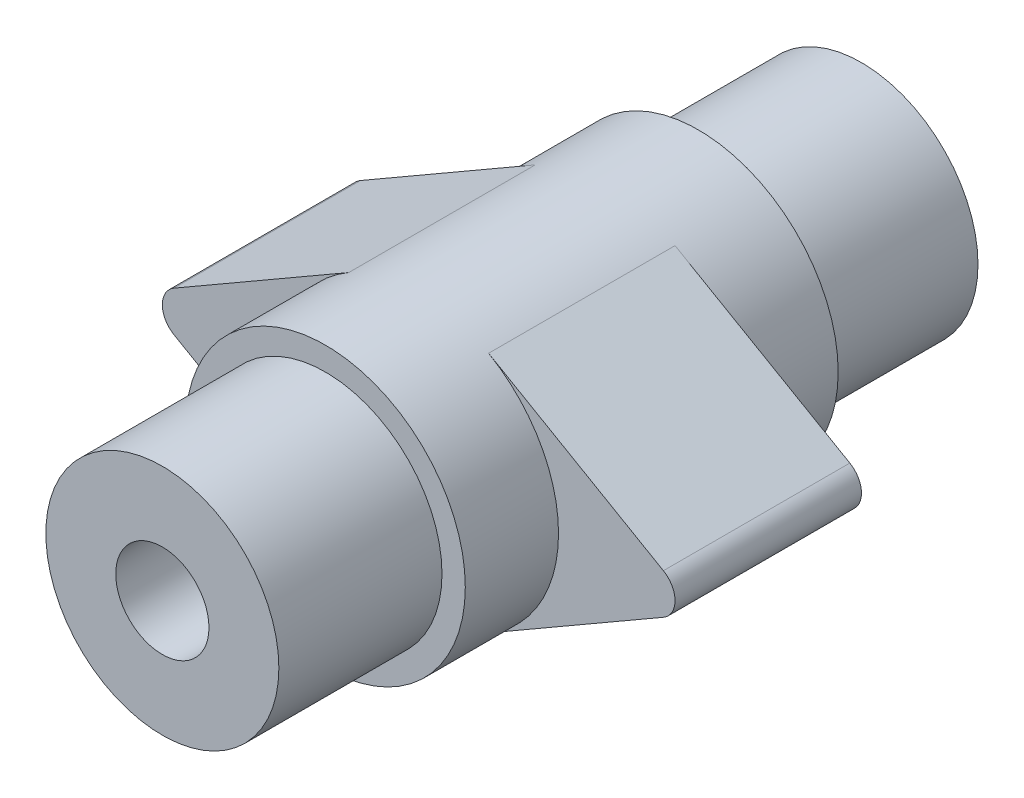
ISO-10303-21;
HEADER;
FILE_DESCRIPTION(('STEP AP214'),'2;1');
FILE_NAME('part.step','',(''),(''),'','','');
FILE_SCHEMA(('AUTOMOTIVE_DESIGN { 1 0 10303 214 1 1 1 1 }'));
ENDSEC;
DATA;
#1=APPLICATION_CONTEXT('core data for automotive mechanical design processes');
#2=APPLICATION_PROTOCOL_DEFINITION('international standard','automotive_design',2000,#1);
#3=PRODUCT_CONTEXT('',#1,'mechanical');
#4=PRODUCT('Part','Part','',(#3));
#5=PRODUCT_RELATED_PRODUCT_CATEGORY('part','',(#4));
#6=PRODUCT_DEFINITION_FORMATION('','',#4);
#7=PRODUCT_DEFINITION_CONTEXT('part definition',#1,'design');
#8=PRODUCT_DEFINITION('design','',#6,#7);
#9=PRODUCT_DEFINITION_SHAPE('','',#8);
#10=(LENGTH_UNIT() NAMED_UNIT(*) SI_UNIT(.MILLI.,.METRE.));
#11=(NAMED_UNIT(*) PLANE_ANGLE_UNIT() SI_UNIT($,.RADIAN.));
#12=(NAMED_UNIT(*) SI_UNIT($,.STERADIAN.) SOLID_ANGLE_UNIT());
#13=UNCERTAINTY_MEASURE_WITH_UNIT(LENGTH_MEASURE(1.E-05),#10,'distance_accuracy_value','');
#14=(GEOMETRIC_REPRESENTATION_CONTEXT(3) GLOBAL_UNCERTAINTY_ASSIGNED_CONTEXT((#13)) GLOBAL_UNIT_ASSIGNED_CONTEXT((#10,
#11,#12)) REPRESENTATION_CONTEXT('',''));
#15=CARTESIAN_POINT('',(0.,0.,0.));
#16=DIRECTION('',(0.,0.,1.));
#17=DIRECTION('',(1.,0.,0.));
#18=AXIS2_PLACEMENT_3D('',#15,#16,#17);
#19=CARTESIAN_POINT('',(0.,0.,16.));
#20=DIRECTION('',(0.,0.,-1.));
#21=DIRECTION('',(-1.,0.,0.));
#22=AXIS2_PLACEMENT_3D('',#19,#20,#21);
#23=CYLINDRICAL_SURFACE('',#22,6.);
#24=DIRECTION('',(0.,0.,-1.));
#25=VECTOR('',#24,1.);
#26=CARTESIAN_POINT('',(-3.,5.19615242270663,12.));
#27=LINE('',#26,#25);
#28=CARTESIAN_POINT('',(-3.,5.19615242270663,12.));
#29=VERTEX_POINT('',#28);
#30=CARTESIAN_POINT('',(-3.,5.19615242270663,4.));
#31=VERTEX_POINT('',#30);
#32=EDGE_CURVE('E61',#29,#31,#27,.T.);
#33=ORIENTED_EDGE('',*,*,#32,.F.);
#34=CARTESIAN_POINT('',(0.,0.,12.));
#35=DIRECTION('',(0.,0.,1.));
#36=DIRECTION('',(1.,0.,0.));
#37=AXIS2_PLACEMENT_3D('',#34,#35,#36);
#38=CIRCLE('',#37,6.);
#39=CARTESIAN_POINT('',(-3.,-5.19615242270663,12.));
#40=VERTEX_POINT('',#39);
#41=EDGE_CURVE('E66',#29,#40,#38,.T.);
#42=ORIENTED_EDGE('',*,*,#41,.T.);
#43=DIRECTION('',(0.,0.,-1.));
#44=VECTOR('',#43,1.);
#45=CARTESIAN_POINT('',(-3.,-5.19615242270663,12.));
#46=LINE('',#45,#44);
#47=CARTESIAN_POINT('',(-3.,-5.19615242270663,4.));
#48=VERTEX_POINT('',#47);
#49=EDGE_CURVE('E107',#40,#48,#46,.T.);
#50=ORIENTED_EDGE('',*,*,#49,.T.);
#51=CARTESIAN_POINT('',(0.,0.,4.));
#52=DIRECTION('',(0.,0.,1.));
#53=DIRECTION('',(1.,0.,0.));
#54=AXIS2_PLACEMENT_3D('',#51,#52,#53);
#55=CIRCLE('',#54,6.);
#56=EDGE_CURVE('E111',#31,#48,#55,.T.);
#57=ORIENTED_EDGE('',*,*,#56,.F.);
#58=EDGE_LOOP('',(#33,#42,#50,#57));
#59=FACE_BOUND('',#58,.T.);
#60=DIRECTION('',(0.,0.,-1.));
#61=VECTOR('',#60,1.);
#62=CARTESIAN_POINT('',(3.,-5.19615242270663,12.));
#63=LINE('',#62,#61);
#64=CARTESIAN_POINT('',(3.,-5.19615242270663,12.));
#65=VERTEX_POINT('',#64);
#66=CARTESIAN_POINT('',(3.,-5.19615242270663,4.));
#67=VERTEX_POINT('',#66);
#68=EDGE_CURVE('E166',#65,#67,#63,.T.);
#69=ORIENTED_EDGE('',*,*,#68,.F.);
#70=CARTESIAN_POINT('',(0.,0.,12.));
#71=DIRECTION('',(0.,0.,1.));
#72=DIRECTION('',(1.,0.,0.));
#73=AXIS2_PLACEMENT_3D('',#70,#71,#72);
#74=CIRCLE('',#73,6.);
#75=CARTESIAN_POINT('',(3.,5.19615242270663,12.));
#76=VERTEX_POINT('',#75);
#77=EDGE_CURVE('E150',#76,#65,#74,.F.);
#78=ORIENTED_EDGE('',*,*,#77,.F.);
#79=DIRECTION('',(0.,0.,-1.));
#80=VECTOR('',#79,1.);
#81=CARTESIAN_POINT('',(3.,5.19615242270663,12.));
#82=LINE('',#81,#80);
#83=CARTESIAN_POINT('',(3.,5.19615242270663,4.));
#84=VERTEX_POINT('',#83);
#85=EDGE_CURVE('E169',#76,#84,#82,.T.);
#86=ORIENTED_EDGE('',*,*,#85,.T.);
#87=CARTESIAN_POINT('',(0.,0.,4.));
#88=DIRECTION('',(0.,0.,1.));
#89=DIRECTION('',(1.,0.,0.));
#90=AXIS2_PLACEMENT_3D('',#87,#88,#89);
#91=CIRCLE('',#90,6.);
#92=EDGE_CURVE('E161',#84,#67,#91,.F.);
#93=ORIENTED_EDGE('',*,*,#92,.T.);
#94=EDGE_LOOP('',(#69,#78,#86,#93));
#95=FACE_BOUND('',#94,.T.);
#96=CARTESIAN_POINT('',(0.,0.,16.));
#97=DIRECTION('',(0.,0.,1.));
#98=DIRECTION('',(1.,0.,0.));
#99=AXIS2_PLACEMENT_3D('',#96,#97,#98);
#100=CIRCLE('',#99,6.);
#101=CARTESIAN_POINT('',(6.,0.,16.));
#102=VERTEX_POINT('',#101);
#103=EDGE_CURVE('E53',#102,#102,#100,.T.);
#104=ORIENTED_EDGE('',*,*,#103,.F.);
#105=EDGE_LOOP('',(#104));
#106=FACE_BOUND('',#105,.T.);
#107=CARTESIAN_POINT('',(0.,0.,0.));
#108=DIRECTION('',(0.,0.,1.));
#109=DIRECTION('',(1.,0.,0.));
#110=AXIS2_PLACEMENT_3D('',#107,#108,#109);
#111=CIRCLE('',#110,6.);
#112=CARTESIAN_POINT('',(6.,0.,0.));
#113=VERTEX_POINT('',#112);
#114=EDGE_CURVE('E48',#113,#113,#111,.T.);
#115=ORIENTED_EDGE('',*,*,#114,.T.);
#116=EDGE_LOOP('',(#115));
#117=FACE_BOUND('',#116,.T.);
#118=ADVANCED_FACE('F45',(#59,#95,#106,#117),#23,.T.);
#119=CARTESIAN_POINT('',(0.,0.,16.));
#120=DIRECTION('',(0.,0.,1.));
#121=DIRECTION('',(1.,0.,0.));
#122=AXIS2_PLACEMENT_3D('',#119,#120,#121);
#123=PLANE('',#122);
#124=CARTESIAN_POINT('',(0.,0.,16.));
#125=DIRECTION('',(0.,0.,1.));
#126=DIRECTION('',(1.,0.,0.));
#127=AXIS2_PLACEMENT_3D('',#124,#125,#126);
#128=CIRCLE('',#127,5.);
#129=CARTESIAN_POINT('',(5.,0.,16.));
#130=VERTEX_POINT('',#129);
#131=EDGE_CURVE('E11',#130,#130,#128,.T.);
#132=ORIENTED_EDGE('',*,*,#131,.F.);
#133=EDGE_LOOP('',(#132));
#134=FACE_BOUND('',#133,.T.);
#135=ORIENTED_EDGE('',*,*,#103,.T.);
#136=EDGE_LOOP('',(#135));
#137=FACE_BOUND('',#136,.T.);
#138=ADVANCED_FACE('F182',(#134,#137),#123,.T.);
#139=CARTESIAN_POINT('',(0.,0.,0.));
#140=DIRECTION('',(0.,0.,1.));
#141=DIRECTION('',(1.,0.,0.));
#142=AXIS2_PLACEMENT_3D('',#139,#140,#141);
#143=PLANE('',#142);
#144=CARTESIAN_POINT('',(0.,0.,0.));
#145=DIRECTION('',(0.,0.,1.));
#146=DIRECTION('',(1.,0.,0.));
#147=AXIS2_PLACEMENT_3D('',#144,#145,#146);
#148=CIRCLE('',#147,5.);
#149=CARTESIAN_POINT('',(5.,0.,0.));
#150=VERTEX_POINT('',#149);
#151=EDGE_CURVE('E344',#150,#150,#148,.T.);
#152=ORIENTED_EDGE('',*,*,#151,.T.);
#153=EDGE_LOOP('',(#152));
#154=FACE_BOUND('',#153,.T.);
#155=ORIENTED_EDGE('',*,*,#114,.F.);
#156=EDGE_LOOP('',(#155));
#157=FACE_BOUND('',#156,.T.);
#158=ADVANCED_FACE('F179',(#154,#157),#143,.F.);
#159=CARTESIAN_POINT('',(10.,0.,12.));
#160=DIRECTION('',(0.,0.,-1.));
#161=DIRECTION('',(-1.,0.,0.));
#162=AXIS2_PLACEMENT_3D('',#159,#160,#161);
#163=CYLINDRICAL_SURFACE('',#162,1.);
#164=CARTESIAN_POINT('',(10.,0.,4.));
#165=DIRECTION('',(0.,0.,1.));
#166=DIRECTION('',(1.,0.,0.));
#167=AXIS2_PLACEMENT_3D('',#164,#165,#166);
#168=CIRCLE('',#167,1.);
#169=CARTESIAN_POINT('',(10.5,0.866025403784439,4.));
#170=VERTEX_POINT('',#169);
#171=CARTESIAN_POINT('',(10.5,-0.866025403784441,4.));
#172=VERTEX_POINT('',#171);
#173=EDGE_CURVE('E138',#170,#172,#168,.F.);
#174=ORIENTED_EDGE('',*,*,#173,.F.);
#175=DIRECTION('',(0.,0.,-1.));
#176=VECTOR('',#175,1.);
#177=CARTESIAN_POINT('',(10.5,0.866025403784439,12.));
#178=LINE('',#177,#176);
#179=CARTESIAN_POINT('',(10.5,0.866025403784439,12.));
#180=VERTEX_POINT('',#179);
#181=EDGE_CURVE('E171',#180,#170,#178,.T.);
#182=ORIENTED_EDGE('',*,*,#181,.F.);
#183=CARTESIAN_POINT('',(10.,0.,12.));
#184=DIRECTION('',(0.,0.,1.));
#185=DIRECTION('',(1.,0.,0.));
#186=AXIS2_PLACEMENT_3D('',#183,#184,#185);
#187=CIRCLE('',#186,1.);
#188=CARTESIAN_POINT('',(10.5,-0.866025403784441,12.));
#189=VERTEX_POINT('',#188);
#190=EDGE_CURVE('E143',#180,#189,#187,.F.);
#191=ORIENTED_EDGE('',*,*,#190,.T.);
#192=DIRECTION('',(0.,0.,-1.));
#193=VECTOR('',#192,1.);
#194=CARTESIAN_POINT('',(10.5,-0.866025403784441,12.));
#195=LINE('',#194,#193);
#196=EDGE_CURVE('E155',#189,#172,#195,.T.);
#197=ORIENTED_EDGE('',*,*,#196,.T.);
#198=EDGE_LOOP('',(#174,#182,#191,#197));
#199=FACE_BOUND('',#198,.T.);
#200=ADVANCED_FACE('F181',(#199),#163,.T.);
#201=CARTESIAN_POINT('',(3.,5.19615242270663,12.));
#202=DIRECTION('',(0.5,0.866025403784439,0.));
#203=DIRECTION('',(-0.866025403784439,0.5,0.));
#204=AXIS2_PLACEMENT_3D('',#201,#202,#203);
#205=PLANE('',#204);
#206=DIRECTION('',(0.866025403784439,-0.5,0.));
#207=VECTOR('',#206,1.);
#208=CARTESIAN_POINT('',(3.,5.19615242270663,4.));
#209=LINE('',#208,#207);
#210=EDGE_CURVE('E158',#84,#170,#209,.T.);
#211=ORIENTED_EDGE('',*,*,#210,.F.);
#212=ORIENTED_EDGE('',*,*,#85,.F.);
#213=DIRECTION('',(0.866025403784439,-0.5,0.));
#214=VECTOR('',#213,1.);
#215=CARTESIAN_POINT('',(3.,5.19615242270663,12.));
#216=LINE('',#215,#214);
#217=EDGE_CURVE('E146',#76,#180,#216,.T.);
#218=ORIENTED_EDGE('',*,*,#217,.T.);
#219=ORIENTED_EDGE('',*,*,#181,.T.);
#220=EDGE_LOOP('',(#211,#212,#218,#219));
#221=FACE_BOUND('',#220,.T.);
#222=ADVANCED_FACE('F189',(#221),#205,.T.);
#223=CARTESIAN_POINT('',(3.,-5.19615242270663,12.));
#224=DIRECTION('',(-0.5,0.866025403784439,0.));
#225=DIRECTION('',(-0.866025403784439,-0.5,0.));
#226=AXIS2_PLACEMENT_3D('',#223,#224,#225);
#227=PLANE('',#226);
#228=DIRECTION('',(0.866025403784439,0.5,0.));
#229=VECTOR('',#228,1.);
#230=CARTESIAN_POINT('',(3.,-5.19615242270663,4.));
#231=LINE('',#230,#229);
#232=EDGE_CURVE('E147',#67,#172,#231,.T.);
#233=ORIENTED_EDGE('',*,*,#232,.T.);
#234=ORIENTED_EDGE('',*,*,#196,.F.);
#235=DIRECTION('',(0.866025403784439,0.5,0.));
#236=VECTOR('',#235,1.);
#237=CARTESIAN_POINT('',(3.,-5.19615242270663,12.));
#238=LINE('',#237,#236);
#239=EDGE_CURVE('E153',#65,#189,#238,.T.);
#240=ORIENTED_EDGE('',*,*,#239,.F.);
#241=ORIENTED_EDGE('',*,*,#68,.T.);
#242=EDGE_LOOP('',(#233,#234,#240,#241));
#243=FACE_BOUND('',#242,.T.);
#244=ADVANCED_FACE('F212',(#243),#227,.F.);
#245=CARTESIAN_POINT('',(0.,0.,12.));
#246=DIRECTION('',(0.,0.,1.));
#247=DIRECTION('',(1.,0.,0.));
#248=AXIS2_PLACEMENT_3D('',#245,#246,#247);
#249=PLANE('',#248);
#250=ORIENTED_EDGE('',*,*,#190,.F.);
#251=ORIENTED_EDGE('',*,*,#217,.F.);
#252=ORIENTED_EDGE('',*,*,#77,.T.);
#253=ORIENTED_EDGE('',*,*,#239,.T.);
#254=EDGE_LOOP('',(#250,#251,#252,#253));
#255=FACE_BOUND('',#254,.T.);
#256=ADVANCED_FACE('F221',(#255),#249,.T.);
#257=CARTESIAN_POINT('',(0.,0.,4.));
#258=DIRECTION('',(0.,0.,1.));
#259=DIRECTION('',(1.,0.,0.));
#260=AXIS2_PLACEMENT_3D('',#257,#258,#259);
#261=PLANE('',#260);
#262=ORIENTED_EDGE('',*,*,#173,.T.);
#263=ORIENTED_EDGE('',*,*,#232,.F.);
#264=ORIENTED_EDGE('',*,*,#92,.F.);
#265=ORIENTED_EDGE('',*,*,#210,.T.);
#266=EDGE_LOOP('',(#262,#263,#264,#265));
#267=FACE_BOUND('',#266,.T.);
#268=ADVANCED_FACE('F230',(#267),#261,.F.);
#269=CARTESIAN_POINT('',(-3.,5.19615242270663,12.));
#270=DIRECTION('',(0.5,-0.866025403784439,0.));
#271=DIRECTION('',(0.866025403784439,0.5,0.));
#272=AXIS2_PLACEMENT_3D('',#269,#270,#271);
#273=PLANE('',#272);
#274=DIRECTION('',(-0.866025403784439,-0.5,0.));
#275=VECTOR('',#274,1.);
#276=CARTESIAN_POINT('',(-3.,5.19615242270663,4.));
#277=LINE('',#276,#275);
#278=CARTESIAN_POINT('',(-10.5,0.866025403784439,4.));
#279=VERTEX_POINT('',#278);
#280=EDGE_CURVE('E128',#31,#279,#277,.T.);
#281=ORIENTED_EDGE('',*,*,#280,.T.);
#282=DIRECTION('',(0.,0.,-1.));
#283=VECTOR('',#282,1.);
#284=CARTESIAN_POINT('',(-10.5,0.866025403784439,12.));
#285=LINE('',#284,#283);
#286=CARTESIAN_POINT('',(-10.5,0.866025403784439,12.));
#287=VERTEX_POINT('',#286);
#288=EDGE_CURVE('E353',#287,#279,#285,.T.);
#289=ORIENTED_EDGE('',*,*,#288,.F.);
#290=DIRECTION('',(-0.866025403784439,-0.5,0.));
#291=VECTOR('',#290,1.);
#292=CARTESIAN_POINT('',(-3.,5.19615242270663,12.));
#293=LINE('',#292,#291);
#294=EDGE_CURVE('E129',#29,#287,#293,.T.);
#295=ORIENTED_EDGE('',*,*,#294,.F.);
#296=ORIENTED_EDGE('',*,*,#32,.T.);
#297=EDGE_LOOP('',(#281,#289,#295,#296));
#298=FACE_BOUND('',#297,.T.);
#299=ADVANCED_FACE('F239',(#298),#273,.F.);
#300=CARTESIAN_POINT('',(-10.,0.,12.));
#301=DIRECTION('',(0.,0.,-1.));
#302=DIRECTION('',(-1.,0.,0.));
#303=AXIS2_PLACEMENT_3D('',#300,#301,#302);
#304=CYLINDRICAL_SURFACE('',#303,1.);
#305=CARTESIAN_POINT('',(-10.,0.,4.));
#306=DIRECTION('',(0.,0.,1.));
#307=DIRECTION('',(1.,0.,0.));
#308=AXIS2_PLACEMENT_3D('',#305,#306,#307);
#309=CIRCLE('',#308,1.);
#310=CARTESIAN_POINT('',(-10.5,-0.866025403784439,4.));
#311=VERTEX_POINT('',#310);
#312=EDGE_CURVE('E123',#279,#311,#309,.T.);
#313=ORIENTED_EDGE('',*,*,#312,.T.);
#314=DIRECTION('',(0.,0.,-1.));
#315=VECTOR('',#314,1.);
#316=CARTESIAN_POINT('',(-10.5,-0.866025403784439,12.));
#317=LINE('',#316,#315);
#318=CARTESIAN_POINT('',(-10.5,-0.866025403784439,12.));
#319=VERTEX_POINT('',#318);
#320=EDGE_CURVE('E115',#319,#311,#317,.T.);
#321=ORIENTED_EDGE('',*,*,#320,.F.);
#322=CARTESIAN_POINT('',(-10.,0.,12.));
#323=DIRECTION('',(0.,0.,1.));
#324=DIRECTION('',(1.,0.,0.));
#325=AXIS2_PLACEMENT_3D('',#322,#323,#324);
#326=CIRCLE('',#325,1.);
#327=EDGE_CURVE('E132',#287,#319,#326,.T.);
#328=ORIENTED_EDGE('',*,*,#327,.F.);
#329=ORIENTED_EDGE('',*,*,#288,.T.);
#330=EDGE_LOOP('',(#313,#321,#328,#329));
#331=FACE_BOUND('',#330,.T.);
#332=ADVANCED_FACE('F248',(#331),#304,.T.);
#333=CARTESIAN_POINT('',(-3.,-5.19615242270663,12.));
#334=DIRECTION('',(-0.5,-0.866025403784439,0.));
#335=DIRECTION('',(0.866025403784438,-0.5,0.));
#336=AXIS2_PLACEMENT_3D('',#333,#334,#335);
#337=PLANE('',#336);
#338=DIRECTION('',(-0.866025403784438,0.5,0.));
#339=VECTOR('',#338,1.);
#340=CARTESIAN_POINT('',(-3.,-5.19615242270663,4.));
#341=LINE('',#340,#339);
#342=EDGE_CURVE('E118',#48,#311,#341,.T.);
#343=ORIENTED_EDGE('',*,*,#342,.F.);
#344=ORIENTED_EDGE('',*,*,#49,.F.);
#345=DIRECTION('',(-0.866025403784438,0.5,0.));
#346=VECTOR('',#345,1.);
#347=CARTESIAN_POINT('',(-3.,-5.19615242270663,12.));
#348=LINE('',#347,#346);
#349=EDGE_CURVE('E140',#40,#319,#348,.T.);
#350=ORIENTED_EDGE('',*,*,#349,.T.);
#351=ORIENTED_EDGE('',*,*,#320,.T.);
#352=EDGE_LOOP('',(#343,#344,#350,#351));
#353=FACE_BOUND('',#352,.T.);
#354=ADVANCED_FACE('F119',(#353),#337,.T.);
#355=CARTESIAN_POINT('',(-10.,0.,12.));
#356=DIRECTION('',(0.,0.,1.));
#357=DIRECTION('',(1.,0.,0.));
#358=AXIS2_PLACEMENT_3D('',#355,#356,#357);
#359=PLANE('',#358);
#360=ORIENTED_EDGE('',*,*,#294,.T.);
#361=ORIENTED_EDGE('',*,*,#327,.T.);
#362=ORIENTED_EDGE('',*,*,#349,.F.);
#363=ORIENTED_EDGE('',*,*,#41,.F.);
#364=EDGE_LOOP('',(#360,#361,#362,#363));
#365=FACE_BOUND('',#364,.T.);
#366=ADVANCED_FACE('F265',(#365),#359,.T.);
#367=CARTESIAN_POINT('',(-10.,0.,4.));
#368=DIRECTION('',(0.,0.,1.));
#369=DIRECTION('',(1.,0.,0.));
#370=AXIS2_PLACEMENT_3D('',#367,#368,#369);
#371=PLANE('',#370);
#372=ORIENTED_EDGE('',*,*,#280,.F.);
#373=ORIENTED_EDGE('',*,*,#56,.T.);
#374=ORIENTED_EDGE('',*,*,#342,.T.);
#375=ORIENTED_EDGE('',*,*,#312,.F.);
#376=EDGE_LOOP('',(#372,#373,#374,#375));
#377=FACE_BOUND('',#376,.T.);
#378=ADVANCED_FACE('F126',(#377),#371,.F.);
#379=CARTESIAN_POINT('',(0.,0.,23.));
#380=DIRECTION('',(0.,0.,-1.));
#381=DIRECTION('',(-1.,0.,0.));
#382=AXIS2_PLACEMENT_3D('',#379,#380,#381);
#383=CYLINDRICAL_SURFACE('',#382,5.);
#384=CARTESIAN_POINT('',(0.,0.,23.));
#385=DIRECTION('',(0.,0.,1.));
#386=DIRECTION('',(1.,0.,0.));
#387=AXIS2_PLACEMENT_3D('',#384,#385,#386);
#388=CIRCLE('',#387,5.);
#389=CARTESIAN_POINT('',(5.,0.,23.));
#390=VERTEX_POINT('',#389);
#391=EDGE_CURVE('E350',#390,#390,#388,.T.);
#392=ORIENTED_EDGE('',*,*,#391,.F.);
#393=EDGE_LOOP('',(#392));
#394=FACE_BOUND('',#393,.T.);
#395=ORIENTED_EDGE('',*,*,#131,.T.);
#396=EDGE_LOOP('',(#395));
#397=FACE_BOUND('',#396,.T.);
#398=ADVANCED_FACE('F280',(#394,#397),#383,.T.);
#399=CARTESIAN_POINT('',(0.,0.,23.));
#400=DIRECTION('',(0.,0.,1.));
#401=DIRECTION('',(1.,0.,0.));
#402=AXIS2_PLACEMENT_3D('',#399,#400,#401);
#403=PLANE('',#402);
#404=CARTESIAN_POINT('',(0.,0.,23.));
#405=DIRECTION('',(0.,0.,1.));
#406=DIRECTION('',(1.,0.,0.));
#407=AXIS2_PLACEMENT_3D('',#404,#405,#406);
#408=CIRCLE('',#407,2.);
#409=CARTESIAN_POINT('',(2.,0.,23.));
#410=VERTEX_POINT('',#409);
#411=EDGE_CURVE('E342',#410,#410,#408,.T.);
#412=ORIENTED_EDGE('',*,*,#411,.F.);
#413=EDGE_LOOP('',(#412));
#414=FACE_BOUND('',#413,.T.);
#415=ORIENTED_EDGE('',*,*,#391,.T.);
#416=EDGE_LOOP('',(#415));
#417=FACE_BOUND('',#416,.T.);
#418=ADVANCED_FACE('F291',(#414,#417),#403,.T.);
#419=CARTESIAN_POINT('',(0.,0.,-7.));
#420=DIRECTION('',(0.,0.,1.));
#421=DIRECTION('',(1.,0.,0.));
#422=AXIS2_PLACEMENT_3D('',#419,#420,#421);
#423=CYLINDRICAL_SURFACE('',#422,5.);
#424=CARTESIAN_POINT('',(0.,0.,-7.));
#425=DIRECTION('',(0.,0.,1.));
#426=DIRECTION('',(1.,0.,0.));
#427=AXIS2_PLACEMENT_3D('',#424,#425,#426);
#428=CIRCLE('',#427,5.);
#429=CARTESIAN_POINT('',(5.,0.,-7.));
#430=VERTEX_POINT('',#429);
#431=EDGE_CURVE('E347',#430,#430,#428,.T.);
#432=ORIENTED_EDGE('',*,*,#431,.T.);
#433=EDGE_LOOP('',(#432));
#434=FACE_BOUND('',#433,.T.);
#435=ORIENTED_EDGE('',*,*,#151,.F.);
#436=EDGE_LOOP('',(#435));
#437=FACE_BOUND('',#436,.T.);
#438=ADVANCED_FACE('F304',(#434,#437),#423,.T.);
#439=CARTESIAN_POINT('',(0.,0.,-7.));
#440=DIRECTION('',(0.,0.,1.));
#441=DIRECTION('',(1.,0.,0.));
#442=AXIS2_PLACEMENT_3D('',#439,#440,#441);
#443=PLANE('',#442);
#444=CARTESIAN_POINT('',(0.,0.,-7.));
#445=DIRECTION('',(0.,0.,1.));
#446=DIRECTION('',(1.,0.,0.));
#447=AXIS2_PLACEMENT_3D('',#444,#445,#446);
#448=CIRCLE('',#447,2.);
#449=CARTESIAN_POINT('',(2.,0.,-7.));
#450=VERTEX_POINT('',#449);
#451=EDGE_CURVE('E339',#450,#450,#448,.T.);
#452=ORIENTED_EDGE('',*,*,#451,.T.);
#453=EDGE_LOOP('',(#452));
#454=FACE_BOUND('',#453,.T.);
#455=ORIENTED_EDGE('',*,*,#431,.F.);
#456=EDGE_LOOP('',(#455));
#457=FACE_BOUND('',#456,.T.);
#458=ADVANCED_FACE('F314',(#454,#457),#443,.F.);
#459=CARTESIAN_POINT('',(0.,0.,-7.));
#460=DIRECTION('',(0.,0.,1.));
#461=DIRECTION('',(1.,0.,0.));
#462=AXIS2_PLACEMENT_3D('',#459,#460,#461);
#463=CYLINDRICAL_SURFACE('',#462,2.);
#464=ORIENTED_EDGE('',*,*,#451,.F.);
#465=EDGE_LOOP('',(#464));
#466=FACE_BOUND('',#465,.T.);
#467=ORIENTED_EDGE('',*,*,#411,.T.);
#468=EDGE_LOOP('',(#467));
#469=FACE_BOUND('',#468,.T.);
#470=ADVANCED_FACE('F323',(#466,#469),#463,.F.);
#471=CLOSED_SHELL('',(#118,#138,#158,#200,#222,#244,#256,#268,#299,#332,#354,#366,#378,#398,
#418,#438,#458,#470));
#472=MANIFOLD_SOLID_BREP('B2',#471);
#473=ADVANCED_BREP_SHAPE_REPRESENTATION('',(#18,#472),#14);
#474=SHAPE_DEFINITION_REPRESENTATION(#9,#473);
ENDSEC;
END-ISO-10303-21;
